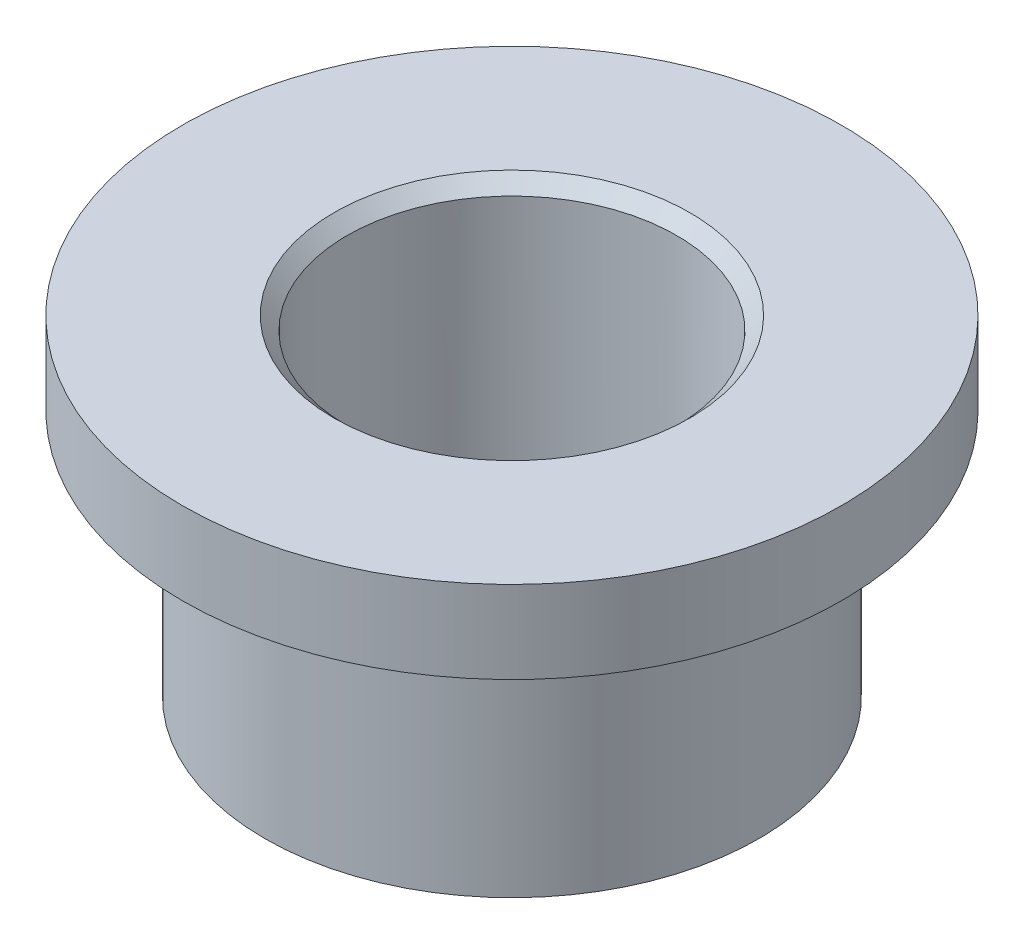
ISO-10303-21;
HEADER;
FILE_DESCRIPTION(('STEP AP214'),'2;1');
FILE_NAME('part.step','',(''),(''),'','','');
FILE_SCHEMA(('AUTOMOTIVE_DESIGN { 1 0 10303 214 1 1 1 1 }'));
ENDSEC;
DATA;
#1=APPLICATION_CONTEXT('core data for automotive mechanical design processes');
#2=APPLICATION_PROTOCOL_DEFINITION('international standard','automotive_design',2000,#1);
#3=PRODUCT_CONTEXT('',#1,'mechanical');
#4=PRODUCT('Part','Part','',(#3));
#5=PRODUCT_RELATED_PRODUCT_CATEGORY('part','',(#4));
#6=PRODUCT_DEFINITION_FORMATION('','',#4);
#7=PRODUCT_DEFINITION_CONTEXT('part definition',#1,'design');
#8=PRODUCT_DEFINITION('design','',#6,#7);
#9=PRODUCT_DEFINITION_SHAPE('','',#8);
#10=(LENGTH_UNIT() NAMED_UNIT(*) SI_UNIT(.MILLI.,.METRE.));
#11=(NAMED_UNIT(*) PLANE_ANGLE_UNIT() SI_UNIT($,.RADIAN.));
#12=(NAMED_UNIT(*) SI_UNIT($,.STERADIAN.) SOLID_ANGLE_UNIT());
#13=UNCERTAINTY_MEASURE_WITH_UNIT(LENGTH_MEASURE(1.E-05),#10,'distance_accuracy_value','');
#14=(GEOMETRIC_REPRESENTATION_CONTEXT(3) GLOBAL_UNCERTAINTY_ASSIGNED_CONTEXT((#13)) GLOBAL_UNIT_ASSIGNED_CONTEXT((#10,
#11,#12)) REPRESENTATION_CONTEXT('',''));
#15=CARTESIAN_POINT('',(0.,0.,0.));
#16=DIRECTION('',(0.,0.,1.));
#17=DIRECTION('',(1.,0.,0.));
#18=AXIS2_PLACEMENT_3D('',#15,#16,#17);
#19=CARTESIAN_POINT('',(0.,6.35,0.));
#20=DIRECTION('',(0.,1.,0.));
#21=DIRECTION('',(0.,0.,1.));
#22=AXIS2_PLACEMENT_3D('',#19,#20,#21);
#23=CYLINDRICAL_SURFACE('',#22,3.175);
#24=CARTESIAN_POINT('',(0.,2.921,0.));
#25=DIRECTION('',(0.,1.,0.));
#26=DIRECTION('',(0.,0.,1.));
#27=AXIS2_PLACEMENT_3D('',#24,#25,#26);
#28=CIRCLE('',#27,3.175);
#29=CARTESIAN_POINT('',(0.,2.921,3.175));
#30=VERTEX_POINT('',#29);
#31=EDGE_CURVE('E46',#30,#30,#28,.T.);
#32=ORIENTED_EDGE('',*,*,#31,.T.);
#33=EDGE_LOOP('',(#32));
#34=FACE_BOUND('',#33,.T.);
#35=CARTESIAN_POINT('',(0.,-2.92099999999999,0.));
#36=DIRECTION('',(0.,-1.,0.));
#37=DIRECTION('',(0.,0.,-1.));
#38=AXIS2_PLACEMENT_3D('',#35,#36,#37);
#39=CIRCLE('',#38,3.175);
#40=CARTESIAN_POINT('',(0.,-2.92099999999999,-3.175));
#41=VERTEX_POINT('',#40);
#42=EDGE_CURVE('E50',#41,#41,#39,.T.);
#43=ORIENTED_EDGE('',*,*,#42,.T.);
#44=EDGE_LOOP('',(#43));
#45=FACE_BOUND('',#44,.T.);
#46=ADVANCED_FACE('F35',(#34,#45),#23,.F.);
#47=CARTESIAN_POINT('',(-3.175,3.175,0.));
#48=DIRECTION('',(0.,1.,0.));
#49=DIRECTION('',(0.,0.,1.));
#50=AXIS2_PLACEMENT_3D('',#47,#48,#49);
#51=PLANE('',#50);
#52=CARTESIAN_POINT('',(0.,3.175,0.));
#53=DIRECTION('',(0.,1.,0.));
#54=DIRECTION('',(0.,0.,1.));
#55=AXIS2_PLACEMENT_3D('',#52,#53,#54);
#56=CIRCLE('',#55,3.429);
#57=CARTESIAN_POINT('',(0.,3.175,3.429));
#58=VERTEX_POINT('',#57);
#59=EDGE_CURVE('E42',#58,#58,#56,.F.);
#60=ORIENTED_EDGE('',*,*,#59,.T.);
#61=EDGE_LOOP('',(#60));
#62=FACE_BOUND('',#61,.T.);
#63=CARTESIAN_POINT('',(0.,3.175,0.));
#64=DIRECTION('',(0.,1.,0.));
#65=DIRECTION('',(0.,0.,1.));
#66=AXIS2_PLACEMENT_3D('',#63,#64,#65);
#67=CIRCLE('',#66,6.35);
#68=CARTESIAN_POINT('',(0.,3.175,6.35));
#69=VERTEX_POINT('',#68);
#70=EDGE_CURVE('E55',#69,#69,#67,.T.);
#71=ORIENTED_EDGE('',*,*,#70,.T.);
#72=EDGE_LOOP('',(#71));
#73=FACE_BOUND('',#72,.T.);
#74=ADVANCED_FACE('F83',(#62,#73),#51,.T.);
#75=CARTESIAN_POINT('',(0.,6.35,0.));
#76=DIRECTION('',(0.,1.,0.));
#77=DIRECTION('',(0.,0.,1.));
#78=AXIS2_PLACEMENT_3D('',#75,#76,#77);
#79=CYLINDRICAL_SURFACE('',#78,6.35);
#80=CARTESIAN_POINT('',(0.,1.5875,0.));
#81=DIRECTION('',(0.,1.,0.));
#82=DIRECTION('',(0.,0.,1.));
#83=AXIS2_PLACEMENT_3D('',#80,#81,#82);
#84=CIRCLE('',#83,6.35);
#85=CARTESIAN_POINT('',(0.,1.5875,6.35));
#86=VERTEX_POINT('',#85);
#87=EDGE_CURVE('E58',#86,#86,#84,.T.);
#88=ORIENTED_EDGE('',*,*,#87,.T.);
#89=EDGE_LOOP('',(#88));
#90=FACE_BOUND('',#89,.T.);
#91=ORIENTED_EDGE('',*,*,#70,.F.);
#92=EDGE_LOOP('',(#91));
#93=FACE_BOUND('',#92,.T.);
#94=ADVANCED_FACE('F89',(#90,#93),#79,.T.);
#95=CARTESIAN_POINT('',(-6.35,1.5875,0.));
#96=DIRECTION('',(0.,-1.,0.));
#97=DIRECTION('',(0.,0.,-1.));
#98=AXIS2_PLACEMENT_3D('',#95,#96,#97);
#99=PLANE('',#98);
#100=CARTESIAN_POINT('',(0.,1.5875,0.));
#101=DIRECTION('',(0.,1.,0.));
#102=DIRECTION('',(0.,0.,1.));
#103=AXIS2_PLACEMENT_3D('',#100,#101,#102);
#104=CIRCLE('',#103,4.7625);
#105=CARTESIAN_POINT('',(0.,1.5875,4.7625));
#106=VERTEX_POINT('',#105);
#107=EDGE_CURVE('E61',#106,#106,#104,.T.);
#108=ORIENTED_EDGE('',*,*,#107,.T.);
#109=EDGE_LOOP('',(#108));
#110=FACE_BOUND('',#109,.T.);
#111=ORIENTED_EDGE('',*,*,#87,.F.);
#112=EDGE_LOOP('',(#111));
#113=FACE_BOUND('',#112,.T.);
#114=ADVANCED_FACE('F80',(#110,#113),#99,.T.);
#115=CARTESIAN_POINT('',(0.,6.35,0.));
#116=DIRECTION('',(0.,1.,0.));
#117=DIRECTION('',(0.,0.,1.));
#118=AXIS2_PLACEMENT_3D('',#115,#116,#117);
#119=CYLINDRICAL_SURFACE('',#118,4.7625);
#120=CARTESIAN_POINT('',(0.,-3.175,0.));
#121=DIRECTION('',(0.,1.,0.));
#122=DIRECTION('',(0.,0.,1.));
#123=AXIS2_PLACEMENT_3D('',#120,#121,#122);
#124=CIRCLE('',#123,4.7625);
#125=CARTESIAN_POINT('',(0.,-3.175,4.7625));
#126=VERTEX_POINT('',#125);
#127=EDGE_CURVE('E64',#126,#126,#124,.T.);
#128=ORIENTED_EDGE('',*,*,#127,.T.);
#129=EDGE_LOOP('',(#128));
#130=FACE_BOUND('',#129,.T.);
#131=ORIENTED_EDGE('',*,*,#107,.F.);
#132=EDGE_LOOP('',(#131));
#133=FACE_BOUND('',#132,.T.);
#134=ADVANCED_FACE('F68',(#130,#133),#119,.T.);
#135=CARTESIAN_POINT('',(-4.7625,-3.175,0.));
#136=DIRECTION('',(0.,-1.,0.));
#137=DIRECTION('',(0.,0.,-1.));
#138=AXIS2_PLACEMENT_3D('',#135,#136,#137);
#139=PLANE('',#138);
#140=CARTESIAN_POINT('',(0.,-3.175,0.));
#141=DIRECTION('',(0.,-1.,0.));
#142=DIRECTION('',(0.,0.,-1.));
#143=AXIS2_PLACEMENT_3D('',#140,#141,#142);
#144=CIRCLE('',#143,3.42900000000001);
#145=CARTESIAN_POINT('',(0.,-3.175,-3.42900000000001));
#146=VERTEX_POINT('',#145);
#147=EDGE_CURVE('E10',#146,#146,#144,.F.);
#148=ORIENTED_EDGE('',*,*,#147,.T.);
#149=EDGE_LOOP('',(#148));
#150=FACE_BOUND('',#149,.T.);
#151=ORIENTED_EDGE('',*,*,#127,.F.);
#152=EDGE_LOOP('',(#151));
#153=FACE_BOUND('',#152,.T.);
#154=ADVANCED_FACE('F71',(#150,#153),#139,.T.);
#155=CARTESIAN_POINT('',(0.,2.921,0.));
#156=DIRECTION('',(0.,1.,0.));
#157=DIRECTION('',(0.,0.,1.));
#158=AXIS2_PLACEMENT_3D('',#155,#156,#157);
#159=CONICAL_SURFACE('',#158,3.175,0.785398163397447);
#160=ORIENTED_EDGE('',*,*,#59,.F.);
#161=EDGE_LOOP('',(#160));
#162=FACE_BOUND('',#161,.T.);
#163=ORIENTED_EDGE('',*,*,#31,.F.);
#164=EDGE_LOOP('',(#163));
#165=FACE_BOUND('',#164,.T.);
#166=ADVANCED_FACE('F73',(#162,#165),#159,.F.);
#167=CARTESIAN_POINT('',(0.,-3.175,0.));
#168=DIRECTION('',(0.,-1.,0.));
#169=DIRECTION('',(0.,0.,-1.));
#170=AXIS2_PLACEMENT_3D('',#167,#168,#169);
#171=CONICAL_SURFACE('',#170,3.42900000000001,0.78539816339745);
#172=ORIENTED_EDGE('',*,*,#42,.F.);
#173=EDGE_LOOP('',(#172));
#174=FACE_BOUND('',#173,.T.);
#175=ORIENTED_EDGE('',*,*,#147,.F.);
#176=EDGE_LOOP('',(#175));
#177=FACE_BOUND('',#176,.T.);
#178=ADVANCED_FACE('F37',(#174,#177),#171,.F.);
#179=CLOSED_SHELL('',(#46,#74,#94,#114,#134,#154,#166,#178));
#180=MANIFOLD_SOLID_BREP('B2',#179);
#181=ADVANCED_BREP_SHAPE_REPRESENTATION('',(#18,#180),#14);
#182=SHAPE_DEFINITION_REPRESENTATION(#9,#181);
ENDSEC;
END-ISO-10303-21;
